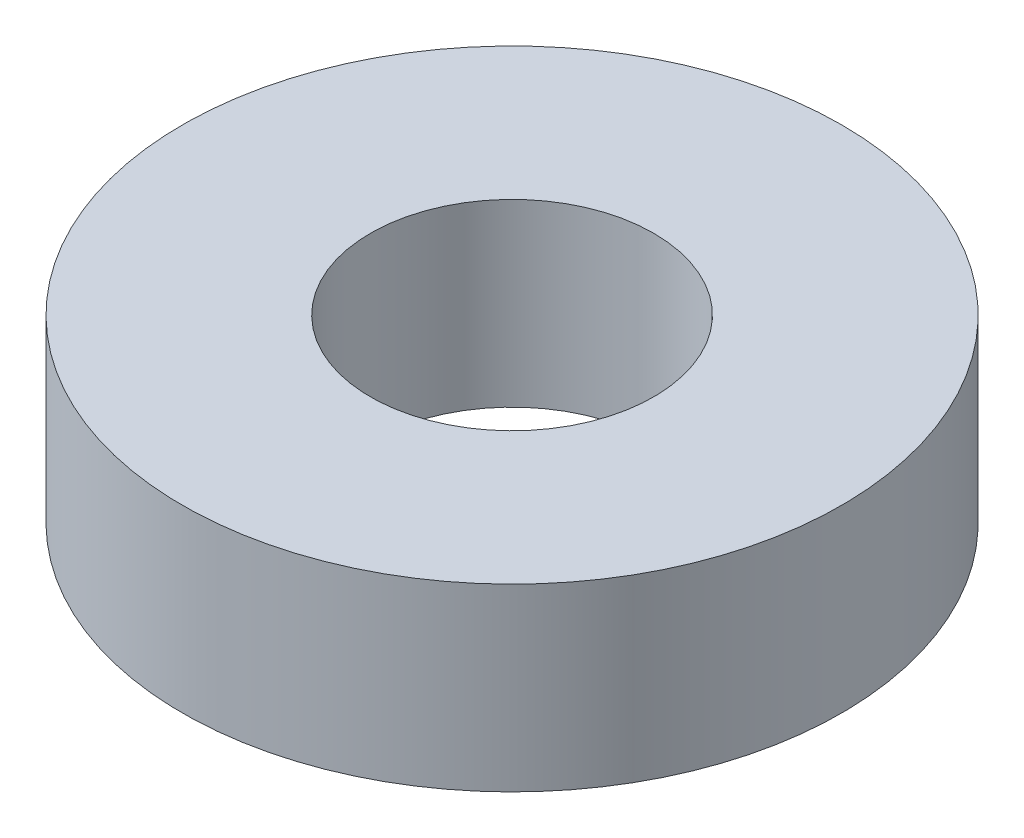
ISO-10303-21;
HEADER;
FILE_DESCRIPTION(('STEP AP214'),'2;1');
FILE_NAME('part.step','',(''),(''),'','','');
FILE_SCHEMA(('AUTOMOTIVE_DESIGN { 1 0 10303 214 1 1 1 1 }'));
ENDSEC;
DATA;
#1=APPLICATION_CONTEXT('core data for automotive mechanical design processes');
#2=APPLICATION_PROTOCOL_DEFINITION('international standard','automotive_design',2000,#1);
#3=PRODUCT_CONTEXT('',#1,'mechanical');
#4=PRODUCT('Part','Part','',(#3));
#5=PRODUCT_RELATED_PRODUCT_CATEGORY('part','',(#4));
#6=PRODUCT_DEFINITION_FORMATION('','',#4);
#7=PRODUCT_DEFINITION_CONTEXT('part definition',#1,'design');
#8=PRODUCT_DEFINITION('design','',#6,#7);
#9=PRODUCT_DEFINITION_SHAPE('','',#8);
#10=(LENGTH_UNIT() NAMED_UNIT(*) SI_UNIT(.MILLI.,.METRE.));
#11=(NAMED_UNIT(*) PLANE_ANGLE_UNIT() SI_UNIT($,.RADIAN.));
#12=(NAMED_UNIT(*) SI_UNIT($,.STERADIAN.) SOLID_ANGLE_UNIT());
#13=UNCERTAINTY_MEASURE_WITH_UNIT(LENGTH_MEASURE(1.E-05),#10,'distance_accuracy_value','');
#14=(GEOMETRIC_REPRESENTATION_CONTEXT(3) GLOBAL_UNCERTAINTY_ASSIGNED_CONTEXT((#13)) GLOBAL_UNIT_ASSIGNED_CONTEXT((#10,
#11,#12)) REPRESENTATION_CONTEXT('',''));
#15=CARTESIAN_POINT('',(0.,0.,0.));
#16=DIRECTION('',(0.,0.,1.));
#17=DIRECTION('',(1.,0.,0.));
#18=AXIS2_PLACEMENT_3D('',#15,#16,#17);
#19=CARTESIAN_POINT('',(0.,7.6,0.));
#20=DIRECTION('',(0.,1.,0.));
#21=DIRECTION('',(0.,0.,1.));
#22=AXIS2_PLACEMENT_3D('',#19,#20,#21);
#23=PLANE('',#22);
#24=CARTESIAN_POINT('',(0.,7.6,0.));
#25=DIRECTION('',(0.,1.,0.));
#26=DIRECTION('',(0.,0.,1.));
#27=AXIS2_PLACEMENT_3D('',#24,#25,#26);
#28=CIRCLE('',#27,13.92);
#29=CARTESIAN_POINT('',(0.,7.6,-13.92));
#30=VERTEX_POINT('',#29);
#31=EDGE_CURVE('E10',#30,#30,#28,.T.);
#32=ORIENTED_EDGE('',*,*,#31,.T.);
#33=EDGE_LOOP('',(#32));
#34=FACE_BOUND('',#33,.T.);
#35=CARTESIAN_POINT('',(0.,7.6,0.));
#36=DIRECTION('',(0.,1.,0.));
#37=DIRECTION('',(0.,0.,1.));
#38=AXIS2_PLACEMENT_3D('',#35,#36,#37);
#39=CIRCLE('',#38,5.985);
#40=CARTESIAN_POINT('',(0.,7.6,-5.985));
#41=VERTEX_POINT('',#40);
#42=EDGE_CURVE('E41',#41,#41,#39,.T.);
#43=ORIENTED_EDGE('',*,*,#42,.F.);
#44=EDGE_LOOP('',(#43));
#45=FACE_BOUND('',#44,.T.);
#46=ADVANCED_FACE('F30',(#34,#45),#23,.T.);
#47=CARTESIAN_POINT('',(0.,0.,0.));
#48=DIRECTION('',(0.,1.,0.));
#49=DIRECTION('',(0.,0.,1.));
#50=AXIS2_PLACEMENT_3D('',#47,#48,#49);
#51=PLANE('',#50);
#52=CARTESIAN_POINT('',(0.,0.,0.));
#53=DIRECTION('',(0.,1.,0.));
#54=DIRECTION('',(0.,0.,1.));
#55=AXIS2_PLACEMENT_3D('',#52,#53,#54);
#56=CIRCLE('',#55,13.92);
#57=CARTESIAN_POINT('',(0.,0.,-13.92));
#58=VERTEX_POINT('',#57);
#59=EDGE_CURVE('E34',#58,#58,#56,.T.);
#60=ORIENTED_EDGE('',*,*,#59,.F.);
#61=EDGE_LOOP('',(#60));
#62=FACE_BOUND('',#61,.T.);
#63=CARTESIAN_POINT('',(0.,0.,0.));
#64=DIRECTION('',(0.,1.,0.));
#65=DIRECTION('',(0.,0.,1.));
#66=AXIS2_PLACEMENT_3D('',#63,#64,#65);
#67=CIRCLE('',#66,5.985);
#68=CARTESIAN_POINT('',(0.,0.,-5.985));
#69=VERTEX_POINT('',#68);
#70=EDGE_CURVE('E43',#69,#69,#67,.T.);
#71=ORIENTED_EDGE('',*,*,#70,.T.);
#72=EDGE_LOOP('',(#71));
#73=FACE_BOUND('',#72,.T.);
#74=ADVANCED_FACE('F53',(#62,#73),#51,.F.);
#75=CARTESIAN_POINT('',(0.,7.6,0.));
#76=DIRECTION('',(0.,-1.,0.));
#77=DIRECTION('',(0.,0.,-1.));
#78=AXIS2_PLACEMENT_3D('',#75,#76,#77);
#79=CYLINDRICAL_SURFACE('',#78,13.92);
#80=CARTESIAN_POINT('',(0.,7.6,-13.92));
#81=CARTESIAN_POINT('',(0.,7.52083333333333,-13.92));
#82=CARTESIAN_POINT('',(0.,7.44166666666667,-13.92));
#83=CARTESIAN_POINT('',(0.,7.28333333333333,-13.92));
#84=CARTESIAN_POINT('',(0.,7.20416666666667,-13.92));
#85=CARTESIAN_POINT('',(0.,7.04583333333333,-13.92));
#86=CARTESIAN_POINT('',(0.,6.96666666666667,-13.92));
#87=CARTESIAN_POINT('',(0.,6.80833333333333,-13.92));
#88=CARTESIAN_POINT('',(0.,6.72916666666667,-13.92));
#89=CARTESIAN_POINT('',(0.,6.57083333333333,-13.92));
#90=CARTESIAN_POINT('',(0.,6.49166666666667,-13.92));
#91=CARTESIAN_POINT('',(0.,6.33333333333333,-13.92));
#92=CARTESIAN_POINT('',(0.,6.25416666666667,-13.92));
#93=CARTESIAN_POINT('',(0.,6.09583333333333,-13.92));
#94=CARTESIAN_POINT('',(0.,6.01666666666667,-13.92));
#95=CARTESIAN_POINT('',(0.,5.85833333333333,-13.92));
#96=CARTESIAN_POINT('',(0.,5.77916666666667,-13.92));
#97=CARTESIAN_POINT('',(0.,5.62083333333333,-13.92));
#98=CARTESIAN_POINT('',(0.,5.54166666666667,-13.92));
#99=CARTESIAN_POINT('',(0.,5.38333333333333,-13.92));
#100=CARTESIAN_POINT('',(0.,5.30416666666667,-13.92));
#101=CARTESIAN_POINT('',(0.,5.14583333333333,-13.92));
#102=CARTESIAN_POINT('',(0.,5.06666666666667,-13.92));
#103=CARTESIAN_POINT('',(0.,4.90833333333333,-13.92));
#104=CARTESIAN_POINT('',(0.,4.82916666666667,-13.92));
#105=CARTESIAN_POINT('',(0.,4.67083333333333,-13.92));
#106=CARTESIAN_POINT('',(0.,4.59166666666667,-13.92));
#107=CARTESIAN_POINT('',(0.,4.43333333333333,-13.92));
#108=CARTESIAN_POINT('',(0.,4.35416666666667,-13.92));
#109=CARTESIAN_POINT('',(0.,4.19583333333333,-13.92));
#110=CARTESIAN_POINT('',(0.,4.11666666666667,-13.92));
#111=CARTESIAN_POINT('',(0.,3.95833333333333,-13.92));
#112=CARTESIAN_POINT('',(0.,3.87916666666667,-13.92));
#113=CARTESIAN_POINT('',(0.,3.72083333333333,-13.92));
#114=CARTESIAN_POINT('',(0.,3.64166666666667,-13.92));
#115=CARTESIAN_POINT('',(0.,3.48333333333333,-13.92));
#116=CARTESIAN_POINT('',(0.,3.40416666666667,-13.92));
#117=CARTESIAN_POINT('',(0.,3.24583333333333,-13.92));
#118=CARTESIAN_POINT('',(0.,3.16666666666667,-13.92));
#119=CARTESIAN_POINT('',(0.,3.00833333333333,-13.92));
#120=CARTESIAN_POINT('',(0.,2.92916666666667,-13.92));
#121=CARTESIAN_POINT('',(0.,2.77083333333333,-13.92));
#122=CARTESIAN_POINT('',(0.,2.69166666666667,-13.92));
#123=CARTESIAN_POINT('',(0.,2.53333333333333,-13.92));
#124=CARTESIAN_POINT('',(0.,2.45416666666667,-13.92));
#125=CARTESIAN_POINT('',(0.,2.29583333333333,-13.92));
#126=CARTESIAN_POINT('',(0.,2.21666666666667,-13.92));
#127=CARTESIAN_POINT('',(0.,2.05833333333333,-13.92));
#128=CARTESIAN_POINT('',(0.,1.97916666666667,-13.92));
#129=CARTESIAN_POINT('',(0.,1.82083333333333,-13.92));
#130=CARTESIAN_POINT('',(0.,1.74166666666667,-13.92));
#131=CARTESIAN_POINT('',(0.,1.58333333333333,-13.92));
#132=CARTESIAN_POINT('',(0.,1.50416666666667,-13.92));
#133=CARTESIAN_POINT('',(0.,1.34583333333333,-13.92));
#134=CARTESIAN_POINT('',(0.,1.26666666666667,-13.92));
#135=CARTESIAN_POINT('',(0.,1.10833333333333,-13.92));
#136=CARTESIAN_POINT('',(0.,1.02916666666667,-13.92));
#137=CARTESIAN_POINT('',(0.,0.870833333333334,-13.92));
#138=CARTESIAN_POINT('',(0.,0.791666666666667,-13.92));
#139=CARTESIAN_POINT('',(0.,0.633333333333334,-13.92));
#140=CARTESIAN_POINT('',(0.,0.554166666666667,-13.92));
#141=CARTESIAN_POINT('',(0.,0.395833333333333,-13.92));
#142=CARTESIAN_POINT('',(0.,0.316666666666666,-13.92));
#143=CARTESIAN_POINT('',(0.,0.158333333333333,-13.92));
#144=CARTESIAN_POINT('',(0.,0.0791666666666666,-13.92));
#145=CARTESIAN_POINT('',(0.,0.,-13.92));
#146=B_SPLINE_CURVE_WITH_KNOTS('',3,(#80,#81,#82,#83,#84,#85,#86,#87,#88,#89,#90,#91,#92,#93,
#94,#95,#96,#97,#98,#99,#100,#101,#102,#103,#104,#105,#106,#107,#108,#109,#110,#111,#112,#113,
#114,#115,#116,#117,#118,#119,#120,#121,#122,#123,#124,#125,#126,#127,#128,#129,#130,#131,#132,
#133,#134,#135,#136,#137,#138,#139,#140,#141,#142,#143,#144,#145),.UNSPECIFIED.,.F.,.F.,(4,2,2,
2,2,2,2,2,2,2,2,2,2,2,2,2,2,2,2,2,2,2,2,2,2,2,2,2,2,2,2,2,4),(0.,0.237500000000001,
0.475000000000001,0.7125,0.95,1.1875,1.425,1.6625,1.9,2.1375,2.375,2.6125,2.85,3.0875,3.325,
3.5625,3.8,4.0375,4.275,4.5125,4.75,4.9875,5.225,5.4625,5.7,5.9375,6.175,6.4125,6.65,6.8875,
7.125,7.3625,7.6),.UNSPECIFIED.);
#147=EDGE_CURVE('BSEAM32',#30,#58,#146,.T.);
#148=ORIENTED_EDGE('',*,*,#31,.F.);
#149=ORIENTED_EDGE('',*,*,#59,.T.);
#150=ORIENTED_EDGE('',*,*,#147,.T.);
#151=ORIENTED_EDGE('',*,*,#147,.F.);
#152=EDGE_LOOP('',(#148,#150,#149,#151));
#153=FACE_BOUND('',#152,.T.);
#154=ADVANCED_FACE('F32',(#153),#79,.T.);
#155=CARTESIAN_POINT('',(0.,7.6,0.));
#156=DIRECTION('',(0.,-1.,0.));
#157=DIRECTION('',(0.,0.,-1.));
#158=AXIS2_PLACEMENT_3D('',#155,#156,#157);
#159=CYLINDRICAL_SURFACE('',#158,5.985);
#160=CARTESIAN_POINT('',(0.,7.6,-5.985));
#161=CARTESIAN_POINT('',(0.,7.52083333333333,-5.985));
#162=CARTESIAN_POINT('',(0.,7.44166666666667,-5.985));
#163=CARTESIAN_POINT('',(0.,7.28333333333333,-5.985));
#164=CARTESIAN_POINT('',(0.,7.20416666666667,-5.985));
#165=CARTESIAN_POINT('',(0.,7.04583333333333,-5.985));
#166=CARTESIAN_POINT('',(0.,6.96666666666667,-5.985));
#167=CARTESIAN_POINT('',(0.,6.80833333333333,-5.985));
#168=CARTESIAN_POINT('',(0.,6.72916666666667,-5.985));
#169=CARTESIAN_POINT('',(0.,6.57083333333333,-5.985));
#170=CARTESIAN_POINT('',(0.,6.49166666666667,-5.985));
#171=CARTESIAN_POINT('',(0.,6.33333333333333,-5.985));
#172=CARTESIAN_POINT('',(0.,6.25416666666667,-5.985));
#173=CARTESIAN_POINT('',(0.,6.09583333333333,-5.985));
#174=CARTESIAN_POINT('',(0.,6.01666666666667,-5.985));
#175=CARTESIAN_POINT('',(0.,5.85833333333333,-5.985));
#176=CARTESIAN_POINT('',(0.,5.77916666666667,-5.985));
#177=CARTESIAN_POINT('',(0.,5.62083333333333,-5.985));
#178=CARTESIAN_POINT('',(0.,5.54166666666667,-5.985));
#179=CARTESIAN_POINT('',(0.,5.38333333333333,-5.985));
#180=CARTESIAN_POINT('',(0.,5.30416666666667,-5.985));
#181=CARTESIAN_POINT('',(0.,5.14583333333333,-5.985));
#182=CARTESIAN_POINT('',(0.,5.06666666666667,-5.985));
#183=CARTESIAN_POINT('',(0.,4.90833333333333,-5.985));
#184=CARTESIAN_POINT('',(0.,4.82916666666667,-5.985));
#185=CARTESIAN_POINT('',(0.,4.67083333333333,-5.985));
#186=CARTESIAN_POINT('',(0.,4.59166666666667,-5.985));
#187=CARTESIAN_POINT('',(0.,4.43333333333333,-5.985));
#188=CARTESIAN_POINT('',(0.,4.35416666666667,-5.985));
#189=CARTESIAN_POINT('',(0.,4.19583333333333,-5.985));
#190=CARTESIAN_POINT('',(0.,4.11666666666667,-5.985));
#191=CARTESIAN_POINT('',(0.,3.95833333333333,-5.985));
#192=CARTESIAN_POINT('',(0.,3.87916666666667,-5.985));
#193=CARTESIAN_POINT('',(0.,3.72083333333333,-5.985));
#194=CARTESIAN_POINT('',(0.,3.64166666666667,-5.985));
#195=CARTESIAN_POINT('',(0.,3.48333333333333,-5.985));
#196=CARTESIAN_POINT('',(0.,3.40416666666667,-5.985));
#197=CARTESIAN_POINT('',(0.,3.24583333333333,-5.985));
#198=CARTESIAN_POINT('',(0.,3.16666666666667,-5.985));
#199=CARTESIAN_POINT('',(0.,3.00833333333333,-5.985));
#200=CARTESIAN_POINT('',(0.,2.92916666666667,-5.985));
#201=CARTESIAN_POINT('',(0.,2.77083333333333,-5.985));
#202=CARTESIAN_POINT('',(0.,2.69166666666667,-5.985));
#203=CARTESIAN_POINT('',(0.,2.53333333333333,-5.985));
#204=CARTESIAN_POINT('',(0.,2.45416666666667,-5.985));
#205=CARTESIAN_POINT('',(0.,2.29583333333333,-5.985));
#206=CARTESIAN_POINT('',(0.,2.21666666666667,-5.985));
#207=CARTESIAN_POINT('',(0.,2.05833333333333,-5.985));
#208=CARTESIAN_POINT('',(0.,1.97916666666667,-5.985));
#209=CARTESIAN_POINT('',(0.,1.82083333333333,-5.985));
#210=CARTESIAN_POINT('',(0.,1.74166666666667,-5.985));
#211=CARTESIAN_POINT('',(0.,1.58333333333333,-5.985));
#212=CARTESIAN_POINT('',(0.,1.50416666666667,-5.985));
#213=CARTESIAN_POINT('',(0.,1.34583333333333,-5.985));
#214=CARTESIAN_POINT('',(0.,1.26666666666667,-5.985));
#215=CARTESIAN_POINT('',(0.,1.10833333333333,-5.985));
#216=CARTESIAN_POINT('',(0.,1.02916666666667,-5.985));
#217=CARTESIAN_POINT('',(0.,0.870833333333333,-5.985));
#218=CARTESIAN_POINT('',(0.,0.791666666666667,-5.985));
#219=CARTESIAN_POINT('',(0.,0.633333333333333,-5.985));
#220=CARTESIAN_POINT('',(0.,0.554166666666666,-5.985));
#221=CARTESIAN_POINT('',(0.,0.395833333333333,-5.985));
#222=CARTESIAN_POINT('',(0.,0.316666666666667,-5.985));
#223=CARTESIAN_POINT('',(0.,0.158333333333333,-5.985));
#224=CARTESIAN_POINT('',(0.,0.0791666666666665,-5.985));
#225=CARTESIAN_POINT('',(0.,0.,-5.985));
#226=B_SPLINE_CURVE_WITH_KNOTS('',3,(#160,#161,#162,#163,#164,#165,#166,#167,#168,#169,#170,
#171,#172,#173,#174,#175,#176,#177,#178,#179,#180,#181,#182,#183,#184,#185,#186,#187,#188,#189,
#190,#191,#192,#193,#194,#195,#196,#197,#198,#199,#200,#201,#202,#203,#204,#205,#206,#207,#208,
#209,#210,#211,#212,#213,#214,#215,#216,#217,#218,#219,#220,#221,#222,#223,#224,#225),
.UNSPECIFIED.,.F.,.F.,(4,2,2,2,2,2,2,2,2,2,2,2,2,2,2,2,2,2,2,2,2,2,2,2,2,2,2,2,2,2,2,2,4),(0.,
0.2375,0.475,0.7125,0.95,1.1875,1.425,1.6625,1.9,2.1375,2.375,2.6125,2.85,3.0875,3.325,3.5625,
3.8,4.0375,4.275,4.5125,4.75,4.9875,5.225,5.4625,5.7,5.9375,6.175,6.4125,6.65,6.8875,7.125,
7.3625,7.6),.UNSPECIFIED.);
#227=EDGE_CURVE('BSEAM49',#41,#69,#226,.T.);
#228=ORIENTED_EDGE('',*,*,#42,.T.);
#229=ORIENTED_EDGE('',*,*,#70,.F.);
#230=ORIENTED_EDGE('',*,*,#227,.T.);
#231=ORIENTED_EDGE('',*,*,#227,.F.);
#232=EDGE_LOOP('',(#228,#230,#229,#231));
#233=FACE_BOUND('',#232,.T.);
#234=ADVANCED_FACE('F49',(#233),#159,.F.);
#235=CLOSED_SHELL('',(#46,#74,#154,#234));
#236=MANIFOLD_SOLID_BREP('B2',#235);
#237=ADVANCED_BREP_SHAPE_REPRESENTATION('',(#18,#236),#14);
#238=SHAPE_DEFINITION_REPRESENTATION(#9,#237);
ENDSEC;
END-ISO-10303-21;
